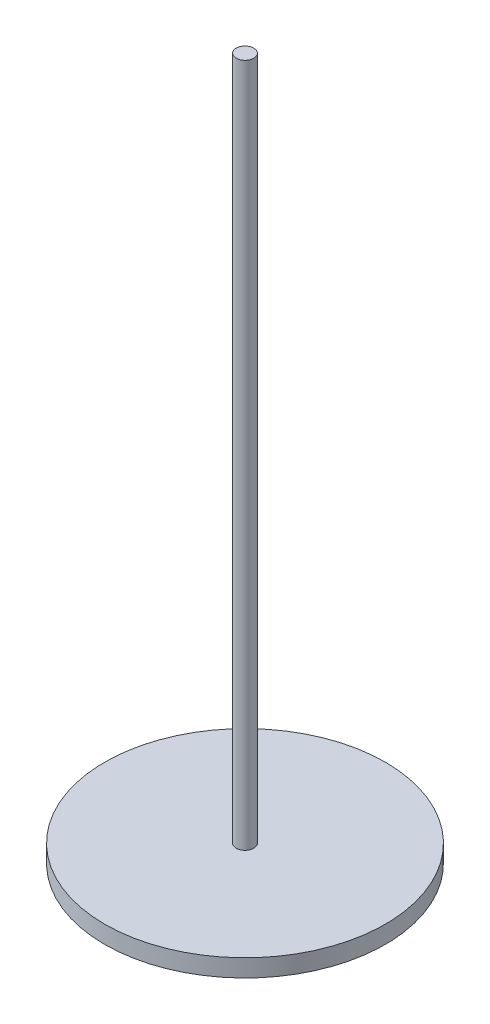
ISO-10303-21;
HEADER;
FILE_DESCRIPTION(('STEP AP214'),'2;1');
FILE_NAME('part.step','',(''),(''),'','','');
FILE_SCHEMA(('AUTOMOTIVE_DESIGN { 1 0 10303 214 1 1 1 1 }'));
ENDSEC;
DATA;
#1=APPLICATION_CONTEXT('core data for automotive mechanical design processes');
#2=APPLICATION_PROTOCOL_DEFINITION('international standard','automotive_design',2000,#1);
#3=PRODUCT_CONTEXT('',#1,'mechanical');
#4=PRODUCT('Part','Part','',(#3));
#5=PRODUCT_RELATED_PRODUCT_CATEGORY('part','',(#4));
#6=PRODUCT_DEFINITION_FORMATION('','',#4);
#7=PRODUCT_DEFINITION_CONTEXT('part definition',#1,'design');
#8=PRODUCT_DEFINITION('design','',#6,#7);
#9=PRODUCT_DEFINITION_SHAPE('','',#8);
#10=(LENGTH_UNIT() NAMED_UNIT(*) SI_UNIT(.MILLI.,.METRE.));
#11=(NAMED_UNIT(*) PLANE_ANGLE_UNIT() SI_UNIT($,.RADIAN.));
#12=(NAMED_UNIT(*) SI_UNIT($,.STERADIAN.) SOLID_ANGLE_UNIT());
#13=UNCERTAINTY_MEASURE_WITH_UNIT(LENGTH_MEASURE(1.E-05),#10,'distance_accuracy_value','');
#14=(GEOMETRIC_REPRESENTATION_CONTEXT(3) GLOBAL_UNCERTAINTY_ASSIGNED_CONTEXT((#13)) GLOBAL_UNIT_ASSIGNED_CONTEXT((#10,
#11,#12)) REPRESENTATION_CONTEXT('',''));
#15=CARTESIAN_POINT('',(0.,0.,0.));
#16=DIRECTION('',(0.,0.,1.));
#17=DIRECTION('',(1.,0.,0.));
#18=AXIS2_PLACEMENT_3D('',#15,#16,#17);
#19=CARTESIAN_POINT('',(0.,76.5845070422535,1.25000000000001));
#20=DIRECTION('',(0.,1.,0.));
#21=DIRECTION('',(0.,0.,1.));
#22=AXIS2_PLACEMENT_3D('',#19,#20,#21);
#23=PLANE('',#22);
#24=CARTESIAN_POINT('',(0.,76.5845070422535,0.));
#25=DIRECTION('',(0.,1.,0.));
#26=DIRECTION('',(0.,0.,1.));
#27=AXIS2_PLACEMENT_3D('',#24,#25,#26);
#28=CIRCLE('',#27,1.25);
#29=CARTESIAN_POINT('',(0.,76.5845070422535,1.25000000000001));
#30=VERTEX_POINT('',#29);
#31=EDGE_CURVE('E54',#30,#30,#28,.T.);
#32=ORIENTED_EDGE('',*,*,#31,.T.);
#33=EDGE_LOOP('',(#32));
#34=FACE_BOUND('',#33,.T.);
#35=ADVANCED_FACE('F37',(#34),#23,.T.);
#36=CARTESIAN_POINT('',(0.,-23.4154929577485,20.));
#37=DIRECTION('',(0.,-1.,0.));
#38=DIRECTION('',(0.,0.,-1.));
#39=AXIS2_PLACEMENT_3D('',#36,#37,#38);
#40=PLANE('',#39);
#41=CARTESIAN_POINT('',(0.,-23.4154929577465,0.));
#42=DIRECTION('',(0.,1.,0.));
#43=DIRECTION('',(0.,0.,1.));
#44=AXIS2_PLACEMENT_3D('',#41,#42,#43);
#45=CIRCLE('',#44,20.0000000000001);
#46=CARTESIAN_POINT('',(0.,-23.4154929577465,20.));
#47=VERTEX_POINT('',#46);
#48=EDGE_CURVE('E10',#47,#47,#45,.T.);
#49=ORIENTED_EDGE('',*,*,#48,.F.);
#50=EDGE_LOOP('',(#49));
#51=FACE_BOUND('',#50,.T.);
#52=ADVANCED_FACE('F73',(#51),#40,.T.);
#53=CARTESIAN_POINT('',(0.,76.5845070422535,0.));
#54=DIRECTION('',(0.,1.,0.));
#55=DIRECTION('',(0.,0.,1.));
#56=AXIS2_PLACEMENT_3D('',#53,#54,#55);
#57=CYLINDRICAL_SURFACE('',#56,20.0000000000001);
#58=ORIENTED_EDGE('',*,*,#48,.T.);
#59=EDGE_LOOP('',(#58));
#60=FACE_BOUND('',#59,.T.);
#61=CARTESIAN_POINT('',(0.,-20.9154929577465,0.));
#62=DIRECTION('',(0.,1.,0.));
#63=DIRECTION('',(0.,0.,1.));
#64=AXIS2_PLACEMENT_3D('',#61,#62,#63);
#65=CIRCLE('',#64,20.0000000000001);
#66=CARTESIAN_POINT('',(0.,-20.9154929577465,20.));
#67=VERTEX_POINT('',#66);
#68=EDGE_CURVE('E44',#67,#67,#65,.T.);
#69=ORIENTED_EDGE('',*,*,#68,.F.);
#70=EDGE_LOOP('',(#69));
#71=FACE_BOUND('',#70,.T.);
#72=ADVANCED_FACE('F70',(#60,#71),#57,.T.);
#73=CARTESIAN_POINT('',(0.,-20.9154929577465,1.25));
#74=DIRECTION('',(0.,1.,0.));
#75=DIRECTION('',(0.,0.,1.));
#76=AXIS2_PLACEMENT_3D('',#73,#74,#75);
#77=PLANE('',#76);
#78=ORIENTED_EDGE('',*,*,#68,.T.);
#79=EDGE_LOOP('',(#78));
#80=FACE_BOUND('',#79,.T.);
#81=CARTESIAN_POINT('',(0.,-20.9154929577465,0.));
#82=DIRECTION('',(0.,1.,0.));
#83=DIRECTION('',(0.,0.,1.));
#84=AXIS2_PLACEMENT_3D('',#81,#82,#83);
#85=CIRCLE('',#84,1.25000000000007);
#86=CARTESIAN_POINT('',(0.,-20.9154929577465,1.25));
#87=VERTEX_POINT('',#86);
#88=EDGE_CURVE('E49',#87,#87,#85,.T.);
#89=ORIENTED_EDGE('',*,*,#88,.F.);
#90=EDGE_LOOP('',(#89));
#91=FACE_BOUND('',#90,.T.);
#92=ADVANCED_FACE('F64',(#80,#91),#77,.T.);
#93=CARTESIAN_POINT('',(0.,76.5845070422535,0.));
#94=DIRECTION('',(0.,1.,0.));
#95=DIRECTION('',(0.,0.,1.));
#96=AXIS2_PLACEMENT_3D('',#93,#94,#95);
#97=CYLINDRICAL_SURFACE('',#96,1.25000000000004);
#98=ORIENTED_EDGE('',*,*,#88,.T.);
#99=EDGE_LOOP('',(#98));
#100=FACE_BOUND('',#99,.T.);
#101=ORIENTED_EDGE('',*,*,#31,.F.);
#102=EDGE_LOOP('',(#101));
#103=FACE_BOUND('',#102,.T.);
#104=ADVANCED_FACE('F62',(#100,#103),#97,.T.);
#105=CLOSED_SHELL('',(#35,#52,#72,#92,#104));
#106=MANIFOLD_SOLID_BREP('B2',#105);
#107=ADVANCED_BREP_SHAPE_REPRESENTATION('',(#18,#106),#14);
#108=SHAPE_DEFINITION_REPRESENTATION(#9,#107);
ENDSEC;
END-ISO-10303-21;
